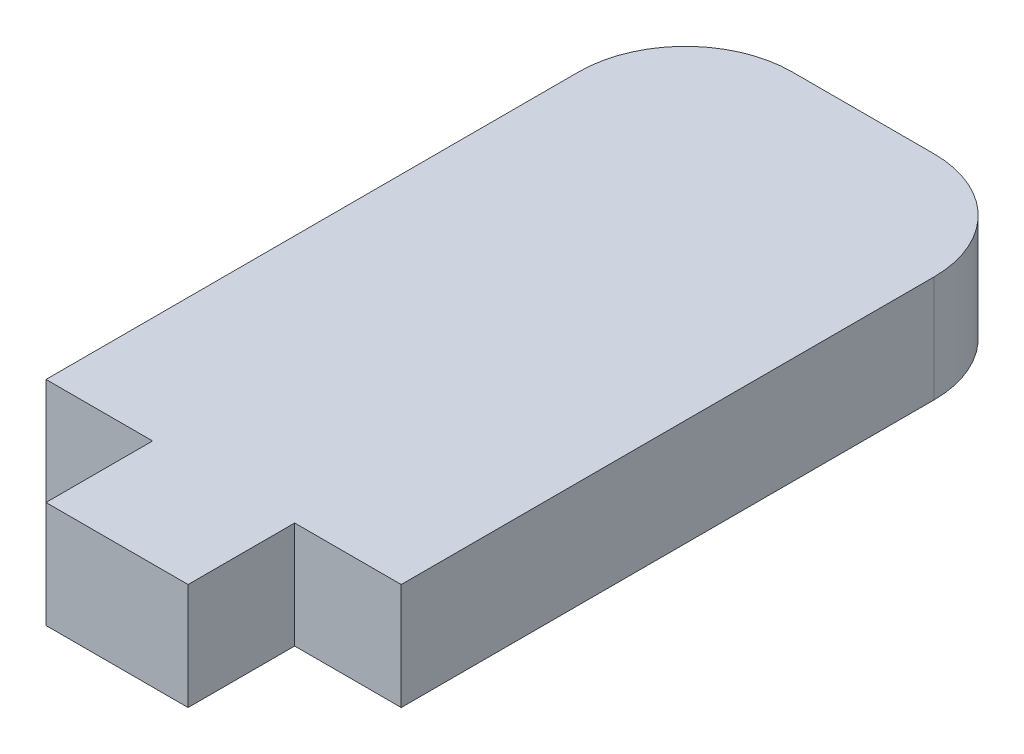
ISO-10303-21;
HEADER;
FILE_DESCRIPTION(('STEP AP214'),'2;1');
FILE_NAME('part.step','',(''),(''),'','','');
FILE_SCHEMA(('AUTOMOTIVE_DESIGN { 1 0 10303 214 1 1 1 1 }'));
ENDSEC;
DATA;
#1=APPLICATION_CONTEXT('core data for automotive mechanical design processes');
#2=APPLICATION_PROTOCOL_DEFINITION('international standard','automotive_design',2000,#1);
#3=PRODUCT_CONTEXT('',#1,'mechanical');
#4=PRODUCT('Part','Part','',(#3));
#5=PRODUCT_RELATED_PRODUCT_CATEGORY('part','',(#4));
#6=PRODUCT_DEFINITION_FORMATION('','',#4);
#7=PRODUCT_DEFINITION_CONTEXT('part definition',#1,'design');
#8=PRODUCT_DEFINITION('design','',#6,#7);
#9=PRODUCT_DEFINITION_SHAPE('','',#8);
#10=(LENGTH_UNIT() NAMED_UNIT(*) SI_UNIT(.MILLI.,.METRE.));
#11=(NAMED_UNIT(*) PLANE_ANGLE_UNIT() SI_UNIT($,.RADIAN.));
#12=(NAMED_UNIT(*) SI_UNIT($,.STERADIAN.) SOLID_ANGLE_UNIT());
#13=UNCERTAINTY_MEASURE_WITH_UNIT(LENGTH_MEASURE(1.E-05),#10,'distance_accuracy_value','');
#14=(GEOMETRIC_REPRESENTATION_CONTEXT(3) GLOBAL_UNCERTAINTY_ASSIGNED_CONTEXT((#13)) GLOBAL_UNIT_ASSIGNED_CONTEXT((#10,
#11,#12)) REPRESENTATION_CONTEXT('',''));
#15=CARTESIAN_POINT('',(0.,0.,0.));
#16=DIRECTION('',(0.,0.,1.));
#17=DIRECTION('',(1.,0.,0.));
#18=AXIS2_PLACEMENT_3D('',#15,#16,#17);
#19=CARTESIAN_POINT('',(-5.,1.5,7.5));
#20=DIRECTION('',(0.,0.,-1.));
#21=DIRECTION('',(-1.,0.,0.));
#22=AXIS2_PLACEMENT_3D('',#19,#20,#21);
#23=PLANE('',#22);
#24=DIRECTION('',(0.,-1.,0.));
#25=VECTOR('',#24,1.);
#26=CARTESIAN_POINT('',(-2.,1.5,7.5));
#27=LINE('',#26,#25);
#28=CARTESIAN_POINT('',(-2.,1.5,7.5));
#29=VERTEX_POINT('',#28);
#30=CARTESIAN_POINT('',(-2.,-1.5,7.5));
#31=VERTEX_POINT('',#30);
#32=EDGE_CURVE('E189',#29,#31,#27,.T.);
#33=ORIENTED_EDGE('',*,*,#32,.F.);
#34=DIRECTION('',(1.,0.,0.));
#35=VECTOR('',#34,1.);
#36=CARTESIAN_POINT('',(-5.,1.5,7.5));
#37=LINE('',#36,#35);
#38=CARTESIAN_POINT('',(-5.,1.5,7.5));
#39=VERTEX_POINT('',#38);
#40=EDGE_CURVE('E144',#39,#29,#37,.T.);
#41=ORIENTED_EDGE('',*,*,#40,.F.);
#42=DIRECTION('',(0.,-1.,0.));
#43=VECTOR('',#42,1.);
#44=CARTESIAN_POINT('',(-5.,1.5,7.5));
#45=LINE('',#44,#43);
#46=CARTESIAN_POINT('',(-5.,-1.5,7.5));
#47=VERTEX_POINT('',#46);
#48=EDGE_CURVE('E136',#39,#47,#45,.T.);
#49=ORIENTED_EDGE('',*,*,#48,.T.);
#50=DIRECTION('',(1.,0.,0.));
#51=VECTOR('',#50,1.);
#52=CARTESIAN_POINT('',(-5.,-1.5,7.5));
#53=LINE('',#52,#51);
#54=EDGE_CURVE('E166',#47,#31,#53,.T.);
#55=ORIENTED_EDGE('',*,*,#54,.T.);
#56=EDGE_LOOP('',(#33,#41,#49,#55));
#57=FACE_BOUND('',#56,.T.);
#58=ADVANCED_FACE('F43',(#57),#23,.F.);
#59=CARTESIAN_POINT('',(5.,1.5,-7.5));
#60=DIRECTION('',(-1.,0.,0.));
#61=DIRECTION('',(0.,0.,1.));
#62=AXIS2_PLACEMENT_3D('',#59,#60,#61);
#63=PLANE('',#62);
#64=DIRECTION('',(0.,0.,-1.));
#65=VECTOR('',#64,1.);
#66=CARTESIAN_POINT('',(5.,-1.5,-7.5));
#67=LINE('',#66,#65);
#68=CARTESIAN_POINT('',(5.,-1.5,7.5));
#69=VERTEX_POINT('',#68);
#70=CARTESIAN_POINT('',(5.,-1.5,-7.5));
#71=VERTEX_POINT('',#70);
#72=EDGE_CURVE('E150',#69,#71,#67,.T.);
#73=ORIENTED_EDGE('',*,*,#72,.T.);
#74=DIRECTION('',(0.,-1.,0.));
#75=VECTOR('',#74,1.);
#76=CARTESIAN_POINT('',(5.,1.5,-7.5));
#77=LINE('',#76,#75);
#78=CARTESIAN_POINT('',(5.,1.5,-7.5));
#79=VERTEX_POINT('',#78);
#80=EDGE_CURVE('E11',#79,#71,#77,.T.);
#81=ORIENTED_EDGE('',*,*,#80,.F.);
#82=DIRECTION('',(0.,0.,-1.));
#83=VECTOR('',#82,1.);
#84=CARTESIAN_POINT('',(5.,1.5,-7.5));
#85=LINE('',#84,#83);
#86=CARTESIAN_POINT('',(5.,1.5,7.5));
#87=VERTEX_POINT('',#86);
#88=EDGE_CURVE('E170',#87,#79,#85,.T.);
#89=ORIENTED_EDGE('',*,*,#88,.F.);
#90=DIRECTION('',(0.,-1.,0.));
#91=VECTOR('',#90,1.);
#92=CARTESIAN_POINT('',(5.,1.5,7.5));
#93=LINE('',#92,#91);
#94=EDGE_CURVE('E149',#87,#69,#93,.T.);
#95=ORIENTED_EDGE('',*,*,#94,.T.);
#96=EDGE_LOOP('',(#73,#81,#89,#95));
#97=FACE_BOUND('',#96,.T.);
#98=ADVANCED_FACE('F45',(#97),#63,.F.);
#99=CARTESIAN_POINT('',(2.,1.5,-7.5));
#100=DIRECTION('',(0.,-1.,0.));
#101=DIRECTION('',(0.,0.,-1.));
#102=AXIS2_PLACEMENT_3D('',#99,#100,#101);
#103=CYLINDRICAL_SURFACE('',#102,3.);
#104=CARTESIAN_POINT('',(2.,-1.5,-7.5));
#105=DIRECTION('',(0.,1.,0.));
#106=DIRECTION('',(0.,0.,-1.));
#107=AXIS2_PLACEMENT_3D('',#104,#105,#106);
#108=CIRCLE('',#107,3.);
#109=CARTESIAN_POINT('',(2.,-1.5,-10.5));
#110=VERTEX_POINT('',#109);
#111=EDGE_CURVE('E154',#71,#110,#108,.T.);
#112=ORIENTED_EDGE('',*,*,#111,.T.);
#113=DIRECTION('',(0.,-1.,0.));
#114=VECTOR('',#113,1.);
#115=CARTESIAN_POINT('',(2.,1.5,-10.5));
#116=LINE('',#115,#114);
#117=CARTESIAN_POINT('',(2.,1.5,-10.5));
#118=VERTEX_POINT('',#117);
#119=EDGE_CURVE('E52',#118,#110,#116,.T.);
#120=ORIENTED_EDGE('',*,*,#119,.F.);
#121=CARTESIAN_POINT('',(2.,1.5,-7.5));
#122=DIRECTION('',(0.,1.,0.));
#123=DIRECTION('',(0.,0.,-1.));
#124=AXIS2_PLACEMENT_3D('',#121,#122,#123);
#125=CIRCLE('',#124,3.);
#126=EDGE_CURVE('E103',#79,#118,#125,.T.);
#127=ORIENTED_EDGE('',*,*,#126,.F.);
#128=ORIENTED_EDGE('',*,*,#80,.T.);
#129=EDGE_LOOP('',(#112,#120,#127,#128));
#130=FACE_BOUND('',#129,.T.);
#131=ADVANCED_FACE('F250',(#130),#103,.T.);
#132=CARTESIAN_POINT('',(-2.,1.5,-10.5));
#133=DIRECTION('',(0.,0.,1.));
#134=DIRECTION('',(1.,0.,0.));
#135=AXIS2_PLACEMENT_3D('',#132,#133,#134);
#136=PLANE('',#135);
#137=DIRECTION('',(-1.,0.,0.));
#138=VECTOR('',#137,1.);
#139=CARTESIAN_POINT('',(-2.,-1.5,-10.5));
#140=LINE('',#139,#138);
#141=CARTESIAN_POINT('',(-2.,-1.5,-10.5));
#142=VERTEX_POINT('',#141);
#143=EDGE_CURVE('E158',#110,#142,#140,.T.);
#144=ORIENTED_EDGE('',*,*,#143,.T.);
#145=DIRECTION('',(0.,-1.,0.));
#146=VECTOR('',#145,1.);
#147=CARTESIAN_POINT('',(-2.,1.5,-10.5));
#148=LINE('',#147,#146);
#149=CARTESIAN_POINT('',(-2.,1.5,-10.5));
#150=VERTEX_POINT('',#149);
#151=EDGE_CURVE('E135',#150,#142,#148,.T.);
#152=ORIENTED_EDGE('',*,*,#151,.F.);
#153=DIRECTION('',(-1.,0.,0.));
#154=VECTOR('',#153,1.);
#155=CARTESIAN_POINT('',(-2.,1.5,-10.5));
#156=LINE('',#155,#154);
#157=EDGE_CURVE('E121',#118,#150,#156,.T.);
#158=ORIENTED_EDGE('',*,*,#157,.F.);
#159=ORIENTED_EDGE('',*,*,#119,.T.);
#160=EDGE_LOOP('',(#144,#152,#158,#159));
#161=FACE_BOUND('',#160,.T.);
#162=ADVANCED_FACE('F180',(#161),#136,.F.);
#163=CARTESIAN_POINT('',(-2.,1.5,-7.5));
#164=DIRECTION('',(0.,-1.,0.));
#165=DIRECTION('',(0.,0.,-1.));
#166=AXIS2_PLACEMENT_3D('',#163,#164,#165);
#167=CYLINDRICAL_SURFACE('',#166,3.);
#168=CARTESIAN_POINT('',(-2.,-1.5,-7.5));
#169=DIRECTION('',(0.,1.,0.));
#170=DIRECTION('',(0.,0.,1.));
#171=AXIS2_PLACEMENT_3D('',#168,#169,#170);
#172=CIRCLE('',#171,3.);
#173=CARTESIAN_POINT('',(-5.,-1.5,-7.5));
#174=VERTEX_POINT('',#173);
#175=EDGE_CURVE('E131',#142,#174,#172,.T.);
#176=ORIENTED_EDGE('',*,*,#175,.T.);
#177=DIRECTION('',(0.,-1.,0.));
#178=VECTOR('',#177,1.);
#179=CARTESIAN_POINT('',(-5.,1.5,-7.5));
#180=LINE('',#179,#178);
#181=CARTESIAN_POINT('',(-5.,1.5,-7.5));
#182=VERTEX_POINT('',#181);
#183=EDGE_CURVE('E128',#182,#174,#180,.T.);
#184=ORIENTED_EDGE('',*,*,#183,.F.);
#185=CARTESIAN_POINT('',(-2.,1.5,-7.5));
#186=DIRECTION('',(0.,1.,0.));
#187=DIRECTION('',(0.,0.,1.));
#188=AXIS2_PLACEMENT_3D('',#185,#186,#187);
#189=CIRCLE('',#188,3.);
#190=EDGE_CURVE('E113',#150,#182,#189,.T.);
#191=ORIENTED_EDGE('',*,*,#190,.F.);
#192=ORIENTED_EDGE('',*,*,#151,.T.);
#193=EDGE_LOOP('',(#176,#184,#191,#192));
#194=FACE_BOUND('',#193,.T.);
#195=ADVANCED_FACE('F129',(#194),#167,.T.);
#196=CARTESIAN_POINT('',(-5.,1.5,-7.5));
#197=DIRECTION('',(1.,0.,0.));
#198=DIRECTION('',(0.,0.,-1.));
#199=AXIS2_PLACEMENT_3D('',#196,#197,#198);
#200=PLANE('',#199);
#201=DIRECTION('',(0.,0.,1.));
#202=VECTOR('',#201,1.);
#203=CARTESIAN_POINT('',(-5.,-1.5,-7.5));
#204=LINE('',#203,#202);
#205=EDGE_CURVE('E163',#174,#47,#204,.T.);
#206=ORIENTED_EDGE('',*,*,#205,.T.);
#207=ORIENTED_EDGE('',*,*,#48,.F.);
#208=DIRECTION('',(0.,0.,1.));
#209=VECTOR('',#208,1.);
#210=CARTESIAN_POINT('',(-5.,1.5,-7.5));
#211=LINE('',#210,#209);
#212=EDGE_CURVE('E118',#182,#39,#211,.T.);
#213=ORIENTED_EDGE('',*,*,#212,.F.);
#214=ORIENTED_EDGE('',*,*,#183,.T.);
#215=EDGE_LOOP('',(#206,#207,#213,#214));
#216=FACE_BOUND('',#215,.T.);
#217=ADVANCED_FACE('F138',(#216),#200,.F.);
#218=CARTESIAN_POINT('',(2.,1.5,7.5));
#219=VERTEX_POINT('',#218);
#220=EDGE_CURVE('E68',#219,#87,#37,.T.);
#221=ORIENTED_EDGE('',*,*,#220,.F.);
#222=DIRECTION('',(0.,-1.,0.));
#223=VECTOR('',#222,1.);
#224=CARTESIAN_POINT('',(2.,1.5,7.5));
#225=LINE('',#224,#223);
#226=CARTESIAN_POINT('',(2.,-1.5,7.5));
#227=VERTEX_POINT('',#226);
#228=EDGE_CURVE('E222',#219,#227,#225,.T.);
#229=ORIENTED_EDGE('',*,*,#228,.T.);
#230=EDGE_CURVE('E95',#227,#69,#53,.T.);
#231=ORIENTED_EDGE('',*,*,#230,.T.);
#232=ORIENTED_EDGE('',*,*,#94,.F.);
#233=EDGE_LOOP('',(#221,#229,#231,#232));
#234=FACE_BOUND('',#233,.T.);
#235=ADVANCED_FACE('F259',(#234),#23,.F.);
#236=CARTESIAN_POINT('',(-2.,1.5,-7.5));
#237=DIRECTION('',(0.,1.,0.));
#238=DIRECTION('',(0.,0.,1.));
#239=AXIS2_PLACEMENT_3D('',#236,#237,#238);
#240=PLANE('',#239);
#241=ORIENTED_EDGE('',*,*,#88,.T.);
#242=ORIENTED_EDGE('',*,*,#126,.T.);
#243=ORIENTED_EDGE('',*,*,#157,.T.);
#244=ORIENTED_EDGE('',*,*,#190,.T.);
#245=ORIENTED_EDGE('',*,*,#212,.T.);
#246=ORIENTED_EDGE('',*,*,#40,.T.);
#247=DIRECTION('',(0.,0.,1.));
#248=VECTOR('',#247,1.);
#249=CARTESIAN_POINT('',(-2.,1.5,7.5));
#250=LINE('',#249,#248);
#251=CARTESIAN_POINT('',(-2.,1.5,10.5));
#252=VERTEX_POINT('',#251);
#253=EDGE_CURVE('E194',#29,#252,#250,.T.);
#254=ORIENTED_EDGE('',*,*,#253,.T.);
#255=DIRECTION('',(1.,0.,0.));
#256=VECTOR('',#255,1.);
#257=CARTESIAN_POINT('',(-2.,1.5,10.5));
#258=LINE('',#257,#256);
#259=CARTESIAN_POINT('',(2.,1.5,10.5));
#260=VERTEX_POINT('',#259);
#261=EDGE_CURVE('E214',#252,#260,#258,.T.);
#262=ORIENTED_EDGE('',*,*,#261,.T.);
#263=DIRECTION('',(0.,0.,-1.));
#264=VECTOR('',#263,1.);
#265=CARTESIAN_POINT('',(2.,1.5,7.5));
#266=LINE('',#265,#264);
#267=EDGE_CURVE('E216',#260,#219,#266,.T.);
#268=ORIENTED_EDGE('',*,*,#267,.T.);
#269=ORIENTED_EDGE('',*,*,#220,.T.);
#270=EDGE_LOOP('',(#241,#242,#243,#244,#245,#246,#254,#262,#268,#269));
#271=FACE_BOUND('',#270,.T.);
#272=ADVANCED_FACE('F115',(#271),#240,.T.);
#273=CARTESIAN_POINT('',(-2.,-1.5,-7.5));
#274=DIRECTION('',(0.,1.,0.));
#275=DIRECTION('',(0.,0.,1.));
#276=AXIS2_PLACEMENT_3D('',#273,#274,#275);
#277=PLANE('',#276);
#278=ORIENTED_EDGE('',*,*,#72,.F.);
#279=ORIENTED_EDGE('',*,*,#230,.F.);
#280=DIRECTION('',(0.,0.,-1.));
#281=VECTOR('',#280,1.);
#282=CARTESIAN_POINT('',(2.,-1.5,7.5));
#283=LINE('',#282,#281);
#284=CARTESIAN_POINT('',(2.,-1.5,10.5));
#285=VERTEX_POINT('',#284);
#286=EDGE_CURVE('E59',#285,#227,#283,.T.);
#287=ORIENTED_EDGE('',*,*,#286,.F.);
#288=DIRECTION('',(1.,0.,0.));
#289=VECTOR('',#288,1.);
#290=CARTESIAN_POINT('',(-2.,-1.5,10.5));
#291=LINE('',#290,#289);
#292=CARTESIAN_POINT('',(-2.,-1.5,10.5));
#293=VERTEX_POINT('',#292);
#294=EDGE_CURVE('E210',#293,#285,#291,.T.);
#295=ORIENTED_EDGE('',*,*,#294,.F.);
#296=DIRECTION('',(0.,0.,1.));
#297=VECTOR('',#296,1.);
#298=CARTESIAN_POINT('',(-2.,-1.5,7.5));
#299=LINE('',#298,#297);
#300=EDGE_CURVE('E231',#31,#293,#299,.T.);
#301=ORIENTED_EDGE('',*,*,#300,.F.);
#302=ORIENTED_EDGE('',*,*,#54,.F.);
#303=ORIENTED_EDGE('',*,*,#205,.F.);
#304=ORIENTED_EDGE('',*,*,#175,.F.);
#305=ORIENTED_EDGE('',*,*,#143,.F.);
#306=ORIENTED_EDGE('',*,*,#111,.F.);
#307=EDGE_LOOP('',(#278,#279,#287,#295,#301,#302,#303,#304,#305,#306));
#308=FACE_BOUND('',#307,.T.);
#309=ADVANCED_FACE('F183',(#308),#277,.F.);
#310=CARTESIAN_POINT('',(-2.,1.5,7.5));
#311=DIRECTION('',(1.,0.,0.));
#312=DIRECTION('',(0.,0.,-1.));
#313=AXIS2_PLACEMENT_3D('',#310,#311,#312);
#314=PLANE('',#313);
#315=ORIENTED_EDGE('',*,*,#300,.T.);
#316=DIRECTION('',(0.,-1.,0.));
#317=VECTOR('',#316,1.);
#318=CARTESIAN_POINT('',(-2.,1.5,10.5));
#319=LINE('',#318,#317);
#320=EDGE_CURVE('E155',#252,#293,#319,.T.);
#321=ORIENTED_EDGE('',*,*,#320,.F.);
#322=ORIENTED_EDGE('',*,*,#253,.F.);
#323=ORIENTED_EDGE('',*,*,#32,.T.);
#324=EDGE_LOOP('',(#315,#321,#322,#323));
#325=FACE_BOUND('',#324,.T.);
#326=ADVANCED_FACE('F270',(#325),#314,.F.);
#327=CARTESIAN_POINT('',(-2.,1.5,10.5));
#328=DIRECTION('',(0.,0.,-1.));
#329=DIRECTION('',(-1.,0.,0.));
#330=AXIS2_PLACEMENT_3D('',#327,#328,#329);
#331=PLANE('',#330);
#332=ORIENTED_EDGE('',*,*,#294,.T.);
#333=DIRECTION('',(0.,-1.,0.));
#334=VECTOR('',#333,1.);
#335=CARTESIAN_POINT('',(2.,1.5,10.5));
#336=LINE('',#335,#334);
#337=EDGE_CURVE('E219',#260,#285,#336,.T.);
#338=ORIENTED_EDGE('',*,*,#337,.F.);
#339=ORIENTED_EDGE('',*,*,#261,.F.);
#340=ORIENTED_EDGE('',*,*,#320,.T.);
#341=EDGE_LOOP('',(#332,#338,#339,#340));
#342=FACE_BOUND('',#341,.T.);
#343=ADVANCED_FACE('F220',(#342),#331,.F.);
#344=CARTESIAN_POINT('',(2.,1.5,7.5));
#345=DIRECTION('',(-1.,0.,0.));
#346=DIRECTION('',(0.,0.,1.));
#347=AXIS2_PLACEMENT_3D('',#344,#345,#346);
#348=PLANE('',#347);
#349=ORIENTED_EDGE('',*,*,#286,.T.);
#350=ORIENTED_EDGE('',*,*,#228,.F.);
#351=ORIENTED_EDGE('',*,*,#267,.F.);
#352=ORIENTED_EDGE('',*,*,#337,.T.);
#353=EDGE_LOOP('',(#349,#350,#351,#352));
#354=FACE_BOUND('',#353,.T.);
#355=ADVANCED_FACE('F224',(#354),#348,.F.);
#356=CLOSED_SHELL('',(#58,#98,#131,#162,#195,#217,#235,#272,#309,#326,#343,#355));
#357=MANIFOLD_SOLID_BREP('B2',#356);
#358=ADVANCED_BREP_SHAPE_REPRESENTATION('',(#18,#357),#14);
#359=SHAPE_DEFINITION_REPRESENTATION(#9,#358);
ENDSEC;
END-ISO-10303-21;
